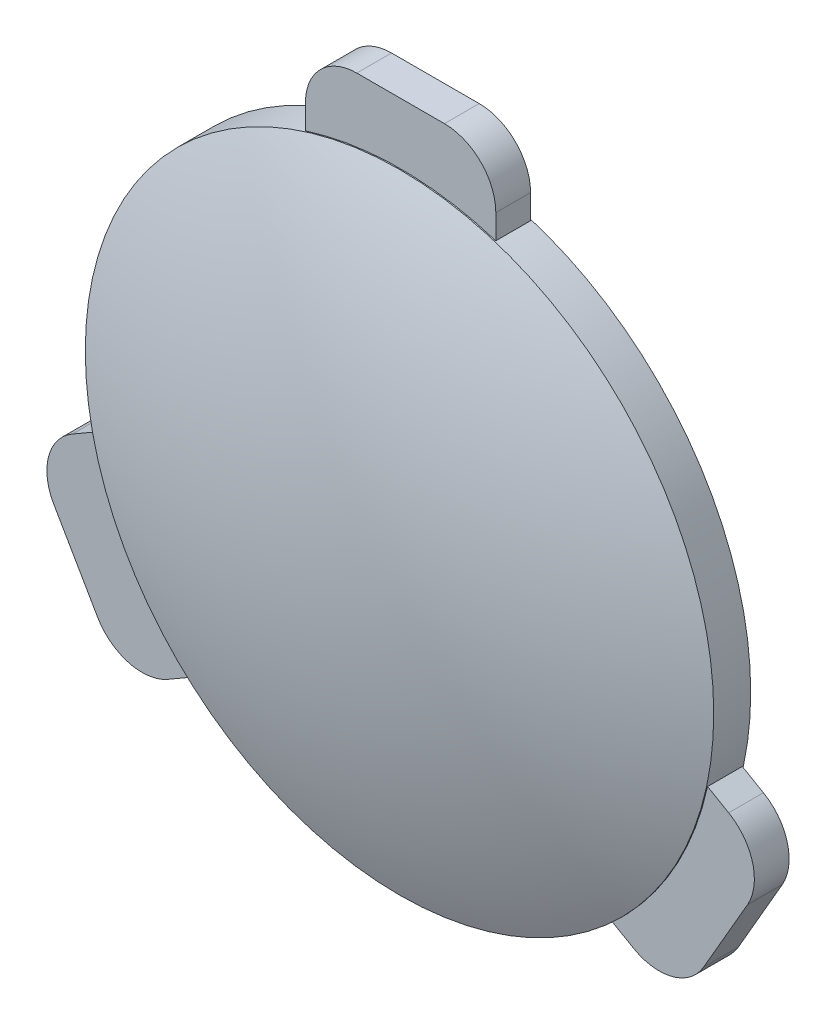
ISO-10303-21;
HEADER;
FILE_DESCRIPTION(('STEP AP214'),'2;1');
FILE_NAME('part.step','',(''),(''),'','','');
FILE_SCHEMA(('AUTOMOTIVE_DESIGN { 1 0 10303 214 1 1 1 1 }'));
ENDSEC;
DATA;
#1=APPLICATION_CONTEXT('core data for automotive mechanical design processes');
#2=APPLICATION_PROTOCOL_DEFINITION('international standard','automotive_design',2000,#1);
#3=PRODUCT_CONTEXT('',#1,'mechanical');
#4=PRODUCT('Part','Part','',(#3));
#5=PRODUCT_RELATED_PRODUCT_CATEGORY('part','',(#4));
#6=PRODUCT_DEFINITION_FORMATION('','',#4);
#7=PRODUCT_DEFINITION_CONTEXT('part definition',#1,'design');
#8=PRODUCT_DEFINITION('design','',#6,#7);
#9=PRODUCT_DEFINITION_SHAPE('','',#8);
#10=(LENGTH_UNIT() NAMED_UNIT(*) SI_UNIT(.MILLI.,.METRE.));
#11=(NAMED_UNIT(*) PLANE_ANGLE_UNIT() SI_UNIT($,.RADIAN.));
#12=(NAMED_UNIT(*) SI_UNIT($,.STERADIAN.) SOLID_ANGLE_UNIT());
#13=UNCERTAINTY_MEASURE_WITH_UNIT(LENGTH_MEASURE(1.E-05),#10,'distance_accuracy_value','');
#14=(GEOMETRIC_REPRESENTATION_CONTEXT(3) GLOBAL_UNCERTAINTY_ASSIGNED_CONTEXT((#13)) GLOBAL_UNIT_ASSIGNED_CONTEXT((#10,
#11,#12)) REPRESENTATION_CONTEXT('',''));
#15=CARTESIAN_POINT('',(0.,0.,0.));
#16=DIRECTION('',(0.,0.,1.));
#17=DIRECTION('',(1.,0.,0.));
#18=AXIS2_PLACEMENT_3D('',#15,#16,#17);
#19=CARTESIAN_POINT('',(0.,0.,0.));
#20=DIRECTION('',(0.,0.,1.));
#21=DIRECTION('',(1.,0.,0.));
#22=AXIS2_PLACEMENT_3D('',#19,#20,#21);
#23=CYLINDRICAL_SURFACE('',#22,17.);
#24=DIRECTION('',(0.,0.,-1.));
#25=VECTOR('',#24,1.);
#26=CARTESIAN_POINT('',(11.4556138497216,-12.5606095125224,0.94));
#27=LINE('',#26,#25);
#28=CARTESIAN_POINT('',(11.4556138497216,-12.5606095125224,0.94));
#29=VERTEX_POINT('',#28);
#30=CARTESIAN_POINT('',(11.4556138497216,-12.5606095125224,-0.94));
#31=VERTEX_POINT('',#30);
#32=EDGE_CURVE('E255',#29,#31,#27,.T.);
#33=ORIENTED_EDGE('',*,*,#32,.F.);
#34=CARTESIAN_POINT('',(0.,0.,0.94));
#35=DIRECTION('',(0.,0.,-1.));
#36=DIRECTION('',(-0.500000000000004,-0.866025403784436,0.));
#37=AXIS2_PLACEMENT_3D('',#34,#35,#36);
#38=CIRCLE('',#37,17.);
#39=CARTESIAN_POINT('',(16.6056138497216,-3.64054785354268,0.94));
#40=VERTEX_POINT('',#39);
#41=EDGE_CURVE('E234',#40,#29,#38,.T.);
#42=ORIENTED_EDGE('',*,*,#41,.F.);
#43=DIRECTION('',(0.,0.,-1.));
#44=VECTOR('',#43,1.);
#45=CARTESIAN_POINT('',(16.6056138497216,-3.64054785354269,0.94));
#46=LINE('',#45,#44);
#47=CARTESIAN_POINT('',(16.6056138497216,-3.64054785354269,-0.94));
#48=VERTEX_POINT('',#47);
#49=EDGE_CURVE('E226',#40,#48,#46,.T.);
#50=ORIENTED_EDGE('',*,*,#49,.T.);
#51=CARTESIAN_POINT('',(0.,0.,-0.94));
#52=DIRECTION('',(0.,0.,-1.));
#53=DIRECTION('',(-0.500000000000004,-0.866025403784436,0.));
#54=AXIS2_PLACEMENT_3D('',#51,#52,#53);
#55=CIRCLE('',#54,17.);
#56=EDGE_CURVE('E209',#48,#31,#55,.T.);
#57=ORIENTED_EDGE('',*,*,#56,.T.);
#58=EDGE_LOOP('',(#33,#42,#50,#57));
#59=FACE_BOUND('',#58,.T.);
#60=DIRECTION('',(0.,0.,-1.));
#61=VECTOR('',#60,1.);
#62=CARTESIAN_POINT('',(5.15,16.2011573660649,0.94));
#63=LINE('',#62,#61);
#64=CARTESIAN_POINT('',(5.15,16.2011573660649,0.94));
#65=VERTEX_POINT('',#64);
#66=CARTESIAN_POINT('',(5.15,16.2011573660649,-0.94));
#67=VERTEX_POINT('',#66);
#68=EDGE_CURVE('E299',#65,#67,#63,.T.);
#69=ORIENTED_EDGE('',*,*,#68,.F.);
#70=CARTESIAN_POINT('',(0.,0.,0.94));
#71=DIRECTION('',(0.,0.,-1.));
#72=DIRECTION('',(1.,0.,0.));
#73=AXIS2_PLACEMENT_3D('',#70,#71,#72);
#74=CIRCLE('',#73,17.);
#75=CARTESIAN_POINT('',(-5.15,16.2011573660649,0.94));
#76=VERTEX_POINT('',#75);
#77=EDGE_CURVE('E259',#76,#65,#74,.T.);
#78=ORIENTED_EDGE('',*,*,#77,.F.);
#79=DIRECTION('',(0.,0.,-1.));
#80=VECTOR('',#79,1.);
#81=CARTESIAN_POINT('',(-5.15,16.2011573660649,0.94));
#82=LINE('',#81,#80);
#83=CARTESIAN_POINT('',(-5.15,16.2011573660649,-0.94));
#84=VERTEX_POINT('',#83);
#85=EDGE_CURVE('E274',#76,#84,#82,.T.);
#86=ORIENTED_EDGE('',*,*,#85,.T.);
#87=CARTESIAN_POINT('',(0.,0.,-0.94));
#88=DIRECTION('',(0.,0.,-1.));
#89=DIRECTION('',(1.,0.,0.));
#90=AXIS2_PLACEMENT_3D('',#87,#88,#89);
#91=CIRCLE('',#90,17.);
#92=EDGE_CURVE('E258',#84,#67,#91,.T.);
#93=ORIENTED_EDGE('',*,*,#92,.T.);
#94=EDGE_LOOP('',(#69,#78,#86,#93));
#95=FACE_BOUND('',#94,.T.);
#96=CARTESIAN_POINT('',(0.,0.,1.));
#97=DIRECTION('',(0.,0.,1.));
#98=DIRECTION('',(1.,0.,0.));
#99=AXIS2_PLACEMENT_3D('',#96,#97,#98);
#100=CIRCLE('',#99,17.);
#101=CARTESIAN_POINT('',(17.,0.,1.));
#102=VERTEX_POINT('',#101);
#103=EDGE_CURVE('E44',#102,#102,#100,.T.);
#104=ORIENTED_EDGE('',*,*,#103,.F.);
#105=EDGE_LOOP('',(#104));
#106=FACE_BOUND('',#105,.T.);
#107=CARTESIAN_POINT('',(0.,0.,-1.));
#108=DIRECTION('',(0.,0.,1.));
#109=DIRECTION('',(1.,0.,0.));
#110=AXIS2_PLACEMENT_3D('',#107,#108,#109);
#111=CIRCLE('',#110,17.);
#112=CARTESIAN_POINT('',(17.,0.,-1.));
#113=VERTEX_POINT('',#112);
#114=EDGE_CURVE('E11',#113,#113,#111,.T.);
#115=ORIENTED_EDGE('',*,*,#114,.T.);
#116=EDGE_LOOP('',(#115));
#117=FACE_BOUND('',#116,.T.);
#118=DIRECTION('',(0.,0.,-1.));
#119=VECTOR('',#118,1.);
#120=CARTESIAN_POINT('',(-16.6056138497216,-3.64054785354245,0.94));
#121=LINE('',#120,#119);
#122=CARTESIAN_POINT('',(-16.6056138497217,-3.64054785354245,0.94));
#123=VERTEX_POINT('',#122);
#124=CARTESIAN_POINT('',(-16.6056138497217,-3.64054785354245,-0.94));
#125=VERTEX_POINT('',#124);
#126=EDGE_CURVE('E51',#123,#125,#121,.T.);
#127=ORIENTED_EDGE('',*,*,#126,.F.);
#128=CARTESIAN_POINT('',(0.,0.,0.94));
#129=DIRECTION('',(0.,0.,-1.));
#130=DIRECTION('',(-0.499999999999992,0.866025403784443,0.));
#131=AXIS2_PLACEMENT_3D('',#128,#129,#130);
#132=CIRCLE('',#131,17.);
#133=CARTESIAN_POINT('',(-11.4556138497217,-12.5606095125222,0.94));
#134=VERTEX_POINT('',#133);
#135=EDGE_CURVE('E55',#134,#123,#132,.T.);
#136=ORIENTED_EDGE('',*,*,#135,.F.);
#137=DIRECTION('',(0.,0.,-1.));
#138=VECTOR('',#137,1.);
#139=CARTESIAN_POINT('',(-11.4556138497217,-12.5606095125222,0.94));
#140=LINE('',#139,#138);
#141=CARTESIAN_POINT('',(-11.4556138497217,-12.5606095125222,-0.94));
#142=VERTEX_POINT('',#141);
#143=EDGE_CURVE('E156',#134,#142,#140,.T.);
#144=ORIENTED_EDGE('',*,*,#143,.T.);
#145=CARTESIAN_POINT('',(0.,0.,-0.94));
#146=DIRECTION('',(0.,0.,-1.));
#147=DIRECTION('',(-0.499999999999992,0.866025403784443,0.));
#148=AXIS2_PLACEMENT_3D('',#145,#146,#147);
#149=CIRCLE('',#148,17.);
#150=EDGE_CURVE('E158',#142,#125,#149,.T.);
#151=ORIENTED_EDGE('',*,*,#150,.T.);
#152=EDGE_LOOP('',(#127,#136,#144,#151));
#153=FACE_BOUND('',#152,.T.);
#154=ADVANCED_FACE('F36',(#59,#95,#106,#117,#153),#23,.T.);
#155=CARTESIAN_POINT('',(0.,0.,-39.0917432105379));
#156=DIRECTION('',(0.,0.,1.));
#157=DIRECTION('',(0.,1.,0.));
#158=AXIS2_PLACEMENT_3D('',#155,#156,#157);
#159=SPHERICAL_SURFACE('',#158,43.5470765225372);
#160=ORIENTED_EDGE('',*,*,#103,.T.);
#161=EDGE_LOOP('',(#160));
#162=FACE_BOUND('',#161,.T.);
#163=ADVANCED_FACE('F38',(#162),#159,.T.);
#164=CARTESIAN_POINT('',(0.,0.,40.6653333119993));
#165=DIRECTION('',(0.,0.,1.));
#166=DIRECTION('',(0.,1.,0.));
#167=AXIS2_PLACEMENT_3D('',#164,#165,#166);
#168=SPHERICAL_SURFACE('',#167,45.);
#169=ORIENTED_EDGE('',*,*,#114,.F.);
#170=EDGE_LOOP('',(#169));
#171=FACE_BOUND('',#170,.T.);
#172=ADVANCED_FACE('F311',(#171),#168,.T.);
#173=CARTESIAN_POINT('',(5.15,17.52,0.94));
#174=DIRECTION('',(-1.,0.,0.));
#175=DIRECTION('',(0.,0.,1.));
#176=AXIS2_PLACEMENT_3D('',#173,#174,#175);
#177=PLANE('',#176);
#178=DIRECTION('',(0.,1.,0.));
#179=VECTOR('',#178,1.);
#180=CARTESIAN_POINT('',(5.15,17.52,-0.94));
#181=LINE('',#180,#179);
#182=CARTESIAN_POINT('',(5.15,17.52,-0.94));
#183=VERTEX_POINT('',#182);
#184=EDGE_CURVE('E276',#67,#183,#181,.T.);
#185=ORIENTED_EDGE('',*,*,#184,.T.);
#186=DIRECTION('',(0.,0.,-1.));
#187=VECTOR('',#186,1.);
#188=CARTESIAN_POINT('',(5.15,17.52,0.94));
#189=LINE('',#188,#187);
#190=CARTESIAN_POINT('',(5.15,17.52,0.94));
#191=VERTEX_POINT('',#190);
#192=EDGE_CURVE('E296',#191,#183,#189,.T.);
#193=ORIENTED_EDGE('',*,*,#192,.F.);
#194=DIRECTION('',(0.,1.,0.));
#195=VECTOR('',#194,1.);
#196=CARTESIAN_POINT('',(5.15,17.52,0.94));
#197=LINE('',#196,#195);
#198=EDGE_CURVE('E262',#65,#191,#197,.T.);
#199=ORIENTED_EDGE('',*,*,#198,.F.);
#200=ORIENTED_EDGE('',*,*,#68,.T.);
#201=EDGE_LOOP('',(#185,#193,#199,#200));
#202=FACE_BOUND('',#201,.T.);
#203=ADVANCED_FACE('F313',(#202),#177,.F.);
#204=CARTESIAN_POINT('',(2.37,17.52,0.94));
#205=DIRECTION('',(0.,0.,-1.));
#206=DIRECTION('',(-1.,0.,0.));
#207=AXIS2_PLACEMENT_3D('',#204,#205,#206);
#208=CYLINDRICAL_SURFACE('',#207,2.78);
#209=CARTESIAN_POINT('',(2.37,17.52,-0.94));
#210=DIRECTION('',(0.,0.,1.));
#211=DIRECTION('',(-1.,0.,0.));
#212=AXIS2_PLACEMENT_3D('',#209,#210,#211);
#213=CIRCLE('',#212,2.78);
#214=CARTESIAN_POINT('',(2.36999999999998,20.3,-0.94));
#215=VERTEX_POINT('',#214);
#216=EDGE_CURVE('E278',#183,#215,#213,.T.);
#217=ORIENTED_EDGE('',*,*,#216,.T.);
#218=DIRECTION('',(0.,0.,-1.));
#219=VECTOR('',#218,1.);
#220=CARTESIAN_POINT('',(2.36999999999998,20.3,0.94));
#221=LINE('',#220,#219);
#222=CARTESIAN_POINT('',(2.36999999999998,20.3,0.94));
#223=VERTEX_POINT('',#222);
#224=EDGE_CURVE('E293',#223,#215,#221,.T.);
#225=ORIENTED_EDGE('',*,*,#224,.F.);
#226=CARTESIAN_POINT('',(2.37,17.52,0.94));
#227=DIRECTION('',(0.,0.,1.));
#228=DIRECTION('',(-1.,0.,0.));
#229=AXIS2_PLACEMENT_3D('',#226,#227,#228);
#230=CIRCLE('',#229,2.78);
#231=EDGE_CURVE('E265',#191,#223,#230,.T.);
#232=ORIENTED_EDGE('',*,*,#231,.F.);
#233=ORIENTED_EDGE('',*,*,#192,.T.);
#234=EDGE_LOOP('',(#217,#225,#232,#233));
#235=FACE_BOUND('',#234,.T.);
#236=ADVANCED_FACE('F318',(#235),#208,.T.);
#237=CARTESIAN_POINT('',(-2.36999999999998,20.3,0.94));
#238=DIRECTION('',(0.,-1.,0.));
#239=DIRECTION('',(0.,0.,-1.));
#240=AXIS2_PLACEMENT_3D('',#237,#238,#239);
#241=PLANE('',#240);
#242=DIRECTION('',(-1.,0.,0.));
#243=VECTOR('',#242,1.);
#244=CARTESIAN_POINT('',(-2.36999999999998,20.3,-0.94));
#245=LINE('',#244,#243);
#246=CARTESIAN_POINT('',(-2.36999999999998,20.3,-0.94));
#247=VERTEX_POINT('',#246);
#248=EDGE_CURVE('E280',#215,#247,#245,.T.);
#249=ORIENTED_EDGE('',*,*,#248,.T.);
#250=DIRECTION('',(0.,0.,-1.));
#251=VECTOR('',#250,1.);
#252=CARTESIAN_POINT('',(-2.36999999999998,20.3,0.94));
#253=LINE('',#252,#251);
#254=CARTESIAN_POINT('',(-2.36999999999998,20.3,0.94));
#255=VERTEX_POINT('',#254);
#256=EDGE_CURVE('E290',#255,#247,#253,.T.);
#257=ORIENTED_EDGE('',*,*,#256,.F.);
#258=DIRECTION('',(-1.,0.,0.));
#259=VECTOR('',#258,1.);
#260=CARTESIAN_POINT('',(-2.36999999999998,20.3,0.94));
#261=LINE('',#260,#259);
#262=EDGE_CURVE('E267',#223,#255,#261,.T.);
#263=ORIENTED_EDGE('',*,*,#262,.F.);
#264=ORIENTED_EDGE('',*,*,#224,.T.);
#265=EDGE_LOOP('',(#249,#257,#263,#264));
#266=FACE_BOUND('',#265,.T.);
#267=ADVANCED_FACE('F324',(#266),#241,.F.);
#268=CARTESIAN_POINT('',(-2.37,17.52,0.94));
#269=DIRECTION('',(0.,0.,-1.));
#270=DIRECTION('',(-1.,0.,0.));
#271=AXIS2_PLACEMENT_3D('',#268,#269,#270);
#272=CYLINDRICAL_SURFACE('',#271,2.78);
#273=CARTESIAN_POINT('',(-2.37,17.52,-0.94));
#274=DIRECTION('',(0.,0.,1.));
#275=DIRECTION('',(-1.,0.,0.));
#276=AXIS2_PLACEMENT_3D('',#273,#274,#275);
#277=CIRCLE('',#276,2.78);
#278=CARTESIAN_POINT('',(-5.15,17.52,-0.94));
#279=VERTEX_POINT('',#278);
#280=EDGE_CURVE('E282',#247,#279,#277,.T.);
#281=ORIENTED_EDGE('',*,*,#280,.T.);
#282=DIRECTION('',(0.,0.,-1.));
#283=VECTOR('',#282,1.);
#284=CARTESIAN_POINT('',(-5.15,17.52,0.94));
#285=LINE('',#284,#283);
#286=CARTESIAN_POINT('',(-5.15,17.52,0.94));
#287=VERTEX_POINT('',#286);
#288=EDGE_CURVE('E287',#287,#279,#285,.T.);
#289=ORIENTED_EDGE('',*,*,#288,.F.);
#290=CARTESIAN_POINT('',(-2.37,17.52,0.94));
#291=DIRECTION('',(0.,0.,1.));
#292=DIRECTION('',(-1.,0.,0.));
#293=AXIS2_PLACEMENT_3D('',#290,#291,#292);
#294=CIRCLE('',#293,2.78);
#295=EDGE_CURVE('E269',#255,#287,#294,.T.);
#296=ORIENTED_EDGE('',*,*,#295,.F.);
#297=ORIENTED_EDGE('',*,*,#256,.T.);
#298=EDGE_LOOP('',(#281,#289,#296,#297));
#299=FACE_BOUND('',#298,.T.);
#300=ADVANCED_FACE('F328',(#299),#272,.T.);
#301=CARTESIAN_POINT('',(-5.15,16.2011573660649,0.94));
#302=DIRECTION('',(1.,0.,0.));
#303=DIRECTION('',(0.,0.,-1.));
#304=AXIS2_PLACEMENT_3D('',#301,#302,#303);
#305=PLANE('',#304);
#306=DIRECTION('',(0.,-1.,0.));
#307=VECTOR('',#306,1.);
#308=CARTESIAN_POINT('',(-5.15,16.2011573660649,-0.94));
#309=LINE('',#308,#307);
#310=EDGE_CURVE('E263',#279,#84,#309,.T.);
#311=ORIENTED_EDGE('',*,*,#310,.T.);
#312=ORIENTED_EDGE('',*,*,#85,.F.);
#313=DIRECTION('',(0.,-1.,0.));
#314=VECTOR('',#313,1.);
#315=CARTESIAN_POINT('',(-5.15,16.2011573660649,0.94));
#316=LINE('',#315,#314);
#317=EDGE_CURVE('E271',#287,#76,#316,.T.);
#318=ORIENTED_EDGE('',*,*,#317,.F.);
#319=ORIENTED_EDGE('',*,*,#288,.T.);
#320=EDGE_LOOP('',(#311,#312,#318,#319));
#321=FACE_BOUND('',#320,.T.);
#322=ADVANCED_FACE('F332',(#321),#305,.F.);
#323=CARTESIAN_POINT('',(0.,0.,0.94));
#324=DIRECTION('',(0.,0.,1.));
#325=DIRECTION('',(1.,0.,0.));
#326=AXIS2_PLACEMENT_3D('',#323,#324,#325);
#327=PLANE('',#326);
#328=ORIENTED_EDGE('',*,*,#77,.T.);
#329=ORIENTED_EDGE('',*,*,#198,.T.);
#330=ORIENTED_EDGE('',*,*,#231,.T.);
#331=ORIENTED_EDGE('',*,*,#262,.T.);
#332=ORIENTED_EDGE('',*,*,#295,.T.);
#333=ORIENTED_EDGE('',*,*,#317,.T.);
#334=EDGE_LOOP('',(#328,#329,#330,#331,#332,#333));
#335=FACE_BOUND('',#334,.T.);
#336=ADVANCED_FACE('F336',(#335),#327,.T.);
#337=CARTESIAN_POINT('',(0.,0.,-0.94));
#338=DIRECTION('',(0.,0.,1.));
#339=DIRECTION('',(1.,0.,0.));
#340=AXIS2_PLACEMENT_3D('',#337,#338,#339);
#341=PLANE('',#340);
#342=ORIENTED_EDGE('',*,*,#92,.F.);
#343=ORIENTED_EDGE('',*,*,#310,.F.);
#344=ORIENTED_EDGE('',*,*,#280,.F.);
#345=ORIENTED_EDGE('',*,*,#248,.F.);
#346=ORIENTED_EDGE('',*,*,#216,.F.);
#347=ORIENTED_EDGE('',*,*,#184,.F.);
#348=EDGE_LOOP('',(#342,#343,#344,#345,#346,#347));
#349=FACE_BOUND('',#348,.T.);
#350=ADVANCED_FACE('F338',(#349),#341,.F.);
#351=CARTESIAN_POINT('',(12.5977650743033,-13.2200308294899,0.94));
#352=DIRECTION('',(0.500000000000004,0.866025403784436,0.));
#353=DIRECTION('',(0.,0.,1.));
#354=AXIS2_PLACEMENT_3D('',#351,#352,#353);
#355=PLANE('',#354);
#356=DIRECTION('',(0.866025403784436,-0.500000000000004,0.));
#357=VECTOR('',#356,1.);
#358=CARTESIAN_POINT('',(12.5977650743033,-13.2200308294899,-0.94));
#359=LINE('',#358,#357);
#360=CARTESIAN_POINT('',(12.5977650743033,-13.2200308294899,-0.94));
#361=VERTEX_POINT('',#360);
#362=EDGE_CURVE('E223',#31,#361,#359,.T.);
#363=ORIENTED_EDGE('',*,*,#362,.T.);
#364=DIRECTION('',(0.,0.,-1.));
#365=VECTOR('',#364,1.);
#366=CARTESIAN_POINT('',(12.5977650743033,-13.2200308294899,0.94));
#367=LINE('',#366,#365);
#368=CARTESIAN_POINT('',(12.5977650743033,-13.2200308294899,0.94));
#369=VERTEX_POINT('',#368);
#370=EDGE_CURVE('E252',#369,#361,#367,.T.);
#371=ORIENTED_EDGE('',*,*,#370,.F.);
#372=DIRECTION('',(0.866025403784436,-0.500000000000004,0.));
#373=VECTOR('',#372,1.);
#374=CARTESIAN_POINT('',(12.5977650743033,-13.2200308294899,0.94));
#375=LINE('',#374,#373);
#376=EDGE_CURVE('E237',#29,#369,#375,.T.);
#377=ORIENTED_EDGE('',*,*,#376,.F.);
#378=ORIENTED_EDGE('',*,*,#32,.T.);
#379=EDGE_LOOP('',(#363,#371,#377,#378));
#380=FACE_BOUND('',#379,.T.);
#381=ADVANCED_FACE('F341',(#380),#355,.F.);
#382=CARTESIAN_POINT('',(13.9877650743033,-10.8124802069692,0.94));
#383=DIRECTION('',(0.,0.,-1.));
#384=DIRECTION('',(0.500000000000004,0.866025403784436,0.));
#385=AXIS2_PLACEMENT_3D('',#382,#383,#384);
#386=CYLINDRICAL_SURFACE('',#385,2.78);
#387=CARTESIAN_POINT('',(13.9877650743033,-10.8124802069692,-0.94));
#388=DIRECTION('',(0.,0.,1.));
#389=DIRECTION('',(0.500000000000004,0.866025403784436,0.));
#390=AXIS2_PLACEMENT_3D('',#387,#388,#389);
#391=CIRCLE('',#390,2.78);
#392=CARTESIAN_POINT('',(16.3953156968241,-12.2024802069692,-0.94));
#393=VERTEX_POINT('',#392);
#394=EDGE_CURVE('E220',#361,#393,#391,.T.);
#395=ORIENTED_EDGE('',*,*,#394,.T.);
#396=DIRECTION('',(0.,0.,-1.));
#397=VECTOR('',#396,1.);
#398=CARTESIAN_POINT('',(16.3953156968241,-12.2024802069692,0.94));
#399=LINE('',#398,#397);
#400=CARTESIAN_POINT('',(16.3953156968241,-12.2024802069692,0.94));
#401=VERTEX_POINT('',#400);
#402=EDGE_CURVE('E249',#401,#393,#399,.T.);
#403=ORIENTED_EDGE('',*,*,#402,.F.);
#404=CARTESIAN_POINT('',(13.9877650743033,-10.8124802069692,0.94));
#405=DIRECTION('',(0.,0.,1.));
#406=DIRECTION('',(0.500000000000004,0.866025403784436,0.));
#407=AXIS2_PLACEMENT_3D('',#404,#405,#406);
#408=CIRCLE('',#407,2.78);
#409=EDGE_CURVE('E239',#369,#401,#408,.T.);
#410=ORIENTED_EDGE('',*,*,#409,.F.);
#411=ORIENTED_EDGE('',*,*,#370,.T.);
#412=EDGE_LOOP('',(#395,#403,#410,#411));
#413=FACE_BOUND('',#412,.T.);
#414=ADVANCED_FACE('F348',(#413),#386,.T.);
#415=CARTESIAN_POINT('',(18.7653156968241,-8.09751979303099,0.94));
#416=DIRECTION('',(-0.866025403784436,0.500000000000004,0.));
#417=DIRECTION('',(0.,0.,-1.));
#418=AXIS2_PLACEMENT_3D('',#415,#416,#417);
#419=PLANE('',#418);
#420=DIRECTION('',(0.500000000000004,0.866025403784436,0.));
#421=VECTOR('',#420,1.);
#422=CARTESIAN_POINT('',(18.7653156968241,-8.09751979303099,-0.94));
#423=LINE('',#422,#421);
#424=CARTESIAN_POINT('',(18.7653156968241,-8.09751979303099,-0.94));
#425=VERTEX_POINT('',#424);
#426=EDGE_CURVE('E217',#393,#425,#423,.T.);
#427=ORIENTED_EDGE('',*,*,#426,.T.);
#428=DIRECTION('',(0.,0.,-1.));
#429=VECTOR('',#428,1.);
#430=CARTESIAN_POINT('',(18.7653156968241,-8.09751979303099,0.94));
#431=LINE('',#430,#429);
#432=CARTESIAN_POINT('',(18.7653156968241,-8.09751979303099,0.94));
#433=VERTEX_POINT('',#432);
#434=EDGE_CURVE('E246',#433,#425,#431,.T.);
#435=ORIENTED_EDGE('',*,*,#434,.F.);
#436=DIRECTION('',(0.500000000000004,0.866025403784436,0.));
#437=VECTOR('',#436,1.);
#438=CARTESIAN_POINT('',(18.7653156968241,-8.09751979303099,0.94));
#439=LINE('',#438,#437);
#440=EDGE_CURVE('E241',#401,#433,#439,.T.);
#441=ORIENTED_EDGE('',*,*,#440,.F.);
#442=ORIENTED_EDGE('',*,*,#402,.T.);
#443=EDGE_LOOP('',(#427,#435,#441,#442));
#444=FACE_BOUND('',#443,.T.);
#445=ADVANCED_FACE('F352',(#444),#419,.F.);
#446=CARTESIAN_POINT('',(16.3577650743033,-6.70751979303096,0.94));
#447=DIRECTION('',(0.,0.,-1.));
#448=DIRECTION('',(0.500000000000004,0.866025403784436,0.));
#449=AXIS2_PLACEMENT_3D('',#446,#447,#448);
#450=CYLINDRICAL_SURFACE('',#449,2.78);
#451=CARTESIAN_POINT('',(16.3577650743033,-6.70751979303096,-0.94));
#452=DIRECTION('',(0.,0.,1.));
#453=DIRECTION('',(0.500000000000004,0.866025403784436,0.));
#454=AXIS2_PLACEMENT_3D('',#451,#452,#453);
#455=CIRCLE('',#454,2.78);
#456=CARTESIAN_POINT('',(17.7477650743033,-4.29996917051022,-0.94));
#457=VERTEX_POINT('',#456);
#458=EDGE_CURVE('E214',#425,#457,#455,.T.);
#459=ORIENTED_EDGE('',*,*,#458,.T.);
#460=DIRECTION('',(0.,0.,-1.));
#461=VECTOR('',#460,1.);
#462=CARTESIAN_POINT('',(17.7477650743033,-4.29996917051022,0.94));
#463=LINE('',#462,#461);
#464=CARTESIAN_POINT('',(17.7477650743033,-4.29996917051022,0.94));
#465=VERTEX_POINT('',#464);
#466=EDGE_CURVE('E231',#465,#457,#463,.T.);
#467=ORIENTED_EDGE('',*,*,#466,.F.);
#468=CARTESIAN_POINT('',(16.3577650743033,-6.70751979303096,0.94));
#469=DIRECTION('',(0.,0.,1.));
#470=DIRECTION('',(0.500000000000004,0.866025403784436,0.));
#471=AXIS2_PLACEMENT_3D('',#468,#469,#470);
#472=CIRCLE('',#471,2.78);
#473=EDGE_CURVE('E243',#433,#465,#472,.T.);
#474=ORIENTED_EDGE('',*,*,#473,.F.);
#475=ORIENTED_EDGE('',*,*,#434,.T.);
#476=EDGE_LOOP('',(#459,#467,#474,#475));
#477=FACE_BOUND('',#476,.T.);
#478=ADVANCED_FACE('F356',(#477),#450,.T.);
#479=CARTESIAN_POINT('',(0.,0.,0.94));
#480=DIRECTION('',(0.,0.,1.));
#481=DIRECTION('',(-0.500000000000004,-0.866025403784436,0.));
#482=AXIS2_PLACEMENT_3D('',#479,#480,#481);
#483=PLANE('',#482);
#484=ORIENTED_EDGE('',*,*,#41,.T.);
#485=ORIENTED_EDGE('',*,*,#376,.T.);
#486=ORIENTED_EDGE('',*,*,#409,.T.);
#487=ORIENTED_EDGE('',*,*,#440,.T.);
#488=ORIENTED_EDGE('',*,*,#473,.T.);
#489=DIRECTION('',(-0.866025403784436,0.500000000000004,0.));
#490=VECTOR('',#489,1.);
#491=CARTESIAN_POINT('',(16.6056138497216,-3.64054785354269,0.94));
#492=LINE('',#491,#490);
#493=EDGE_CURVE('E228',#465,#40,#492,.T.);
#494=ORIENTED_EDGE('',*,*,#493,.T.);
#495=EDGE_LOOP('',(#484,#485,#486,#487,#488,#494));
#496=FACE_BOUND('',#495,.T.);
#497=ADVANCED_FACE('F360',(#496),#483,.T.);
#498=CARTESIAN_POINT('',(16.6056138497216,-3.64054785354269,0.94));
#499=DIRECTION('',(-0.500000000000004,-0.866025403784436,0.));
#500=DIRECTION('',(0.,0.,-1.));
#501=AXIS2_PLACEMENT_3D('',#498,#499,#500);
#502=PLANE('',#501);
#503=DIRECTION('',(-0.866025403784436,0.500000000000004,0.));
#504=VECTOR('',#503,1.);
#505=CARTESIAN_POINT('',(16.6056138497216,-3.64054785354269,-0.94));
#506=LINE('',#505,#504);
#507=EDGE_CURVE('E211',#457,#48,#506,.T.);
#508=ORIENTED_EDGE('',*,*,#507,.T.);
#509=ORIENTED_EDGE('',*,*,#49,.F.);
#510=ORIENTED_EDGE('',*,*,#493,.F.);
#511=ORIENTED_EDGE('',*,*,#466,.T.);
#512=EDGE_LOOP('',(#508,#509,#510,#511));
#513=FACE_BOUND('',#512,.T.);
#514=ADVANCED_FACE('F364',(#513),#502,.F.);
#515=CARTESIAN_POINT('',(0.,0.,-0.94));
#516=DIRECTION('',(0.,0.,1.));
#517=DIRECTION('',(-0.500000000000004,-0.866025403784436,0.));
#518=AXIS2_PLACEMENT_3D('',#515,#516,#517);
#519=PLANE('',#518);
#520=ORIENTED_EDGE('',*,*,#56,.F.);
#521=ORIENTED_EDGE('',*,*,#507,.F.);
#522=ORIENTED_EDGE('',*,*,#458,.F.);
#523=ORIENTED_EDGE('',*,*,#426,.F.);
#524=ORIENTED_EDGE('',*,*,#394,.F.);
#525=ORIENTED_EDGE('',*,*,#362,.F.);
#526=EDGE_LOOP('',(#520,#521,#522,#523,#524,#525));
#527=FACE_BOUND('',#526,.T.);
#528=ADVANCED_FACE('F368',(#527),#519,.F.);
#529=CARTESIAN_POINT('',(-17.7477650743034,-4.29996917050997,0.94));
#530=DIRECTION('',(0.499999999999992,-0.866025403784443,0.));
#531=DIRECTION('',(0.,0.,1.));
#532=AXIS2_PLACEMENT_3D('',#529,#530,#531);
#533=PLANE('',#532);
#534=DIRECTION('',(-0.866025403784443,-0.499999999999992,0.));
#535=VECTOR('',#534,1.);
#536=CARTESIAN_POINT('',(-17.7477650743034,-4.29996917050997,-0.94));
#537=LINE('',#536,#535);
#538=CARTESIAN_POINT('',(-17.7477650743034,-4.29996917050997,-0.94));
#539=VERTEX_POINT('',#538);
#540=EDGE_CURVE('E164',#125,#539,#537,.T.);
#541=ORIENTED_EDGE('',*,*,#540,.T.);
#542=DIRECTION('',(0.,0.,-1.));
#543=VECTOR('',#542,1.);
#544=CARTESIAN_POINT('',(-17.7477650743034,-4.29996917050997,0.94));
#545=LINE('',#544,#543);
#546=CARTESIAN_POINT('',(-17.7477650743034,-4.29996917050997,0.94));
#547=VERTEX_POINT('',#546);
#548=EDGE_CURVE('E205',#547,#539,#545,.T.);
#549=ORIENTED_EDGE('',*,*,#548,.F.);
#550=DIRECTION('',(-0.866025403784443,-0.499999999999992,0.));
#551=VECTOR('',#550,1.);
#552=CARTESIAN_POINT('',(-17.7477650743034,-4.29996917050997,0.94));
#553=LINE('',#552,#551);
#554=EDGE_CURVE('E190',#123,#547,#553,.T.);
#555=ORIENTED_EDGE('',*,*,#554,.F.);
#556=ORIENTED_EDGE('',*,*,#126,.T.);
#557=EDGE_LOOP('',(#541,#549,#555,#556));
#558=FACE_BOUND('',#557,.T.);
#559=ADVANCED_FACE('F372',(#558),#533,.F.);
#560=CARTESIAN_POINT('',(-16.3577650743034,-6.70751979303073,0.94));
#561=DIRECTION('',(0.,0.,-1.));
#562=DIRECTION('',(0.499999999999992,-0.866025403784443,0.));
#563=AXIS2_PLACEMENT_3D('',#560,#561,#562);
#564=CYLINDRICAL_SURFACE('',#563,2.78);
#565=CARTESIAN_POINT('',(-16.3577650743034,-6.70751979303073,-0.94));
#566=DIRECTION('',(0.,0.,1.));
#567=DIRECTION('',(0.499999999999992,-0.866025403784443,0.));
#568=AXIS2_PLACEMENT_3D('',#565,#566,#567);
#569=CIRCLE('',#568,2.78);
#570=CARTESIAN_POINT('',(-18.7653156968242,-8.09751979303072,-0.94));
#571=VERTEX_POINT('',#570);
#572=EDGE_CURVE('E183',#539,#571,#569,.T.);
#573=ORIENTED_EDGE('',*,*,#572,.T.);
#574=DIRECTION('',(0.,0.,-1.));
#575=VECTOR('',#574,1.);
#576=CARTESIAN_POINT('',(-18.7653156968242,-8.09751979303072,0.94));
#577=LINE('',#576,#575);
#578=CARTESIAN_POINT('',(-18.7653156968242,-8.09751979303072,0.94));
#579=VERTEX_POINT('',#578);
#580=EDGE_CURVE('E202',#579,#571,#577,.T.);
#581=ORIENTED_EDGE('',*,*,#580,.F.);
#582=CARTESIAN_POINT('',(-16.3577650743034,-6.70751979303073,0.94));
#583=DIRECTION('',(0.,0.,1.));
#584=DIRECTION('',(0.499999999999992,-0.866025403784443,0.));
#585=AXIS2_PLACEMENT_3D('',#582,#583,#584);
#586=CIRCLE('',#585,2.78);
#587=EDGE_CURVE('E192',#547,#579,#586,.T.);
#588=ORIENTED_EDGE('',*,*,#587,.F.);
#589=ORIENTED_EDGE('',*,*,#548,.T.);
#590=EDGE_LOOP('',(#573,#581,#588,#589));
#591=FACE_BOUND('',#590,.T.);
#592=ADVANCED_FACE('F376',(#591),#564,.T.);
#593=CARTESIAN_POINT('',(-16.3953156968242,-12.2024802069689,0.94));
#594=DIRECTION('',(0.866025403784443,0.499999999999992,0.));
#595=DIRECTION('',(0.,0.,-1.));
#596=AXIS2_PLACEMENT_3D('',#593,#594,#595);
#597=PLANE('',#596);
#598=DIRECTION('',(0.499999999999992,-0.866025403784443,0.));
#599=VECTOR('',#598,1.);
#600=CARTESIAN_POINT('',(-16.3953156968242,-12.2024802069689,-0.94));
#601=LINE('',#600,#599);
#602=CARTESIAN_POINT('',(-16.3953156968242,-12.2024802069689,-0.94));
#603=VERTEX_POINT('',#602);
#604=EDGE_CURVE('E178',#571,#603,#601,.T.);
#605=ORIENTED_EDGE('',*,*,#604,.T.);
#606=DIRECTION('',(0.,0.,-1.));
#607=VECTOR('',#606,1.);
#608=CARTESIAN_POINT('',(-16.3953156968242,-12.2024802069689,0.94));
#609=LINE('',#608,#607);
#610=CARTESIAN_POINT('',(-16.3953156968242,-12.2024802069689,0.94));
#611=VERTEX_POINT('',#610);
#612=EDGE_CURVE('E199',#611,#603,#609,.T.);
#613=ORIENTED_EDGE('',*,*,#612,.F.);
#614=DIRECTION('',(0.499999999999992,-0.866025403784443,0.));
#615=VECTOR('',#614,1.);
#616=CARTESIAN_POINT('',(-16.3953156968242,-12.2024802069689,0.94));
#617=LINE('',#616,#615);
#618=EDGE_CURVE('E194',#579,#611,#617,.T.);
#619=ORIENTED_EDGE('',*,*,#618,.F.);
#620=ORIENTED_EDGE('',*,*,#580,.T.);
#621=EDGE_LOOP('',(#605,#613,#619,#620));
#622=FACE_BOUND('',#621,.T.);
#623=ADVANCED_FACE('F380',(#622),#597,.F.);
#624=CARTESIAN_POINT('',(-13.9877650743035,-10.812480206969,0.94));
#625=DIRECTION('',(0.,0.,-1.));
#626=DIRECTION('',(0.499999999999992,-0.866025403784443,0.));
#627=AXIS2_PLACEMENT_3D('',#624,#625,#626);
#628=CYLINDRICAL_SURFACE('',#627,2.78);
#629=CARTESIAN_POINT('',(-13.9877650743035,-10.812480206969,-0.94));
#630=DIRECTION('',(0.,0.,1.));
#631=DIRECTION('',(0.499999999999992,-0.866025403784443,0.));
#632=AXIS2_PLACEMENT_3D('',#629,#630,#631);
#633=CIRCLE('',#632,2.78);
#634=CARTESIAN_POINT('',(-12.5977650743035,-13.2200308294897,-0.94));
#635=VERTEX_POINT('',#634);
#636=EDGE_CURVE('E176',#603,#635,#633,.T.);
#637=ORIENTED_EDGE('',*,*,#636,.T.);
#638=DIRECTION('',(0.,0.,-1.));
#639=VECTOR('',#638,1.);
#640=CARTESIAN_POINT('',(-12.5977650743035,-13.2200308294897,0.94));
#641=LINE('',#640,#639);
#642=CARTESIAN_POINT('',(-12.5977650743035,-13.2200308294897,0.94));
#643=VERTEX_POINT('',#642);
#644=EDGE_CURVE('E175',#643,#635,#641,.T.);
#645=ORIENTED_EDGE('',*,*,#644,.F.);
#646=CARTESIAN_POINT('',(-13.9877650743035,-10.812480206969,0.94));
#647=DIRECTION('',(0.,0.,1.));
#648=DIRECTION('',(0.499999999999992,-0.866025403784443,0.));
#649=AXIS2_PLACEMENT_3D('',#646,#647,#648);
#650=CIRCLE('',#649,2.78);
#651=EDGE_CURVE('E196',#611,#643,#650,.T.);
#652=ORIENTED_EDGE('',*,*,#651,.F.);
#653=ORIENTED_EDGE('',*,*,#612,.T.);
#654=EDGE_LOOP('',(#637,#645,#652,#653));
#655=FACE_BOUND('',#654,.T.);
#656=ADVANCED_FACE('F384',(#655),#628,.T.);
#657=CARTESIAN_POINT('',(0.,0.,0.94));
#658=DIRECTION('',(0.,0.,1.));
#659=DIRECTION('',(-0.499999999999992,0.866025403784443,0.));
#660=AXIS2_PLACEMENT_3D('',#657,#658,#659);
#661=PLANE('',#660);
#662=ORIENTED_EDGE('',*,*,#135,.T.);
#663=ORIENTED_EDGE('',*,*,#554,.T.);
#664=ORIENTED_EDGE('',*,*,#587,.T.);
#665=ORIENTED_EDGE('',*,*,#618,.T.);
#666=ORIENTED_EDGE('',*,*,#651,.T.);
#667=DIRECTION('',(0.866025403784443,0.499999999999992,0.));
#668=VECTOR('',#667,1.);
#669=CARTESIAN_POINT('',(-11.4556138497217,-12.5606095125222,0.94));
#670=LINE('',#669,#668);
#671=EDGE_CURVE('E163',#643,#134,#670,.T.);
#672=ORIENTED_EDGE('',*,*,#671,.T.);
#673=EDGE_LOOP('',(#662,#663,#664,#665,#666,#672));
#674=FACE_BOUND('',#673,.T.);
#675=ADVANCED_FACE('F388',(#674),#661,.T.);
#676=CARTESIAN_POINT('',(-11.4556138497217,-12.5606095125222,0.94));
#677=DIRECTION('',(-0.499999999999992,0.866025403784443,0.));
#678=DIRECTION('',(0.,0.,-1.));
#679=AXIS2_PLACEMENT_3D('',#676,#677,#678);
#680=PLANE('',#679);
#681=DIRECTION('',(0.866025403784443,0.499999999999992,0.));
#682=VECTOR('',#681,1.);
#683=CARTESIAN_POINT('',(-11.4556138497217,-12.5606095125222,-0.94));
#684=LINE('',#683,#682);
#685=EDGE_CURVE('E168',#635,#142,#684,.T.);
#686=ORIENTED_EDGE('',*,*,#685,.T.);
#687=ORIENTED_EDGE('',*,*,#143,.F.);
#688=ORIENTED_EDGE('',*,*,#671,.F.);
#689=ORIENTED_EDGE('',*,*,#644,.T.);
#690=EDGE_LOOP('',(#686,#687,#688,#689));
#691=FACE_BOUND('',#690,.T.);
#692=ADVANCED_FACE('F173',(#691),#680,.F.);
#693=CARTESIAN_POINT('',(0.,0.,-0.94));
#694=DIRECTION('',(0.,0.,1.));
#695=DIRECTION('',(-0.499999999999992,0.866025403784443,0.));
#696=AXIS2_PLACEMENT_3D('',#693,#694,#695);
#697=PLANE('',#696);
#698=ORIENTED_EDGE('',*,*,#150,.F.);
#699=ORIENTED_EDGE('',*,*,#685,.F.);
#700=ORIENTED_EDGE('',*,*,#636,.F.);
#701=ORIENTED_EDGE('',*,*,#604,.F.);
#702=ORIENTED_EDGE('',*,*,#572,.F.);
#703=ORIENTED_EDGE('',*,*,#540,.F.);
#704=EDGE_LOOP('',(#698,#699,#700,#701,#702,#703));
#705=FACE_BOUND('',#704,.T.);
#706=ADVANCED_FACE('F167',(#705),#697,.F.);
#707=CLOSED_SHELL('',(#154,#163,#172,#203,#236,#267,#300,#322,#336,#350,#381,#414,#445,#478,
#497,#514,#528,#559,#592,#623,#656,#675,#692,#706));
#708=MANIFOLD_SOLID_BREP('B2',#707);
#709=ADVANCED_BREP_SHAPE_REPRESENTATION('',(#18,#708),#14);
#710=SHAPE_DEFINITION_REPRESENTATION(#9,#709);
ENDSEC;
END-ISO-10303-21;
